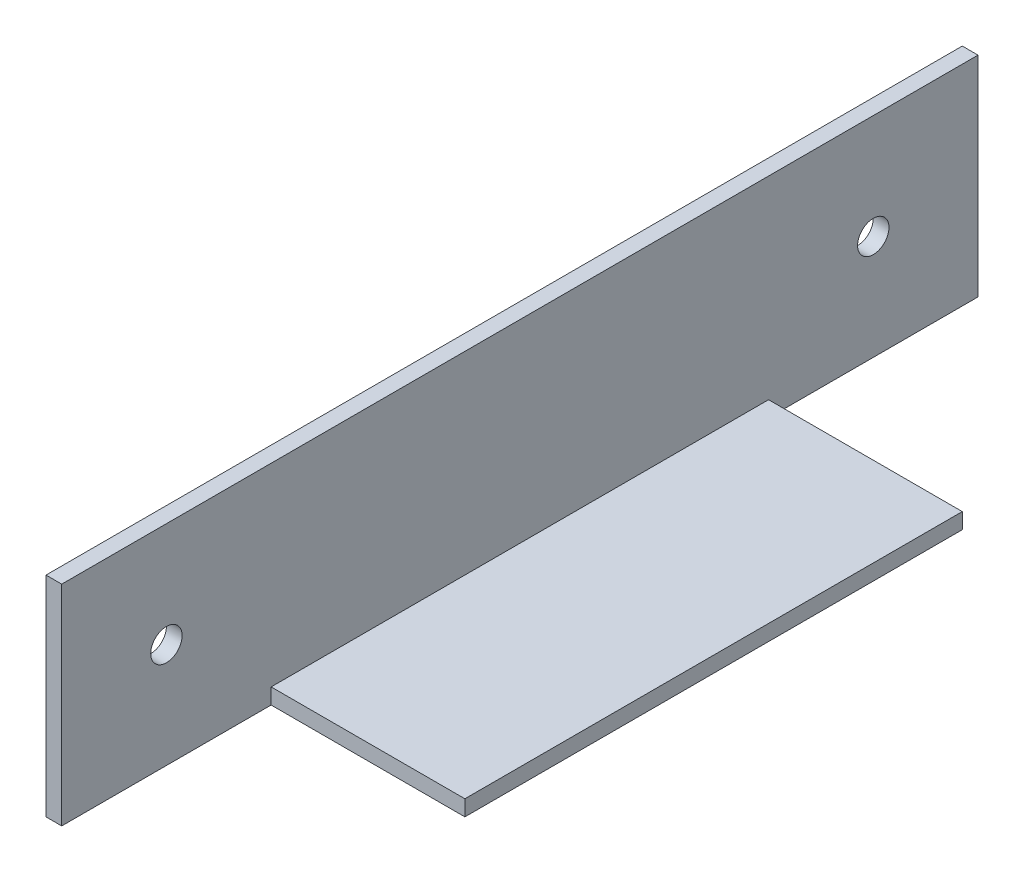
ISO-10303-21;
HEADER;
FILE_DESCRIPTION(('STEP AP214'),'2;1');
FILE_NAME('part.step','',(''),(''),'','','');
FILE_SCHEMA(('AUTOMOTIVE_DESIGN { 1 0 10303 214 1 1 1 1 }'));
ENDSEC;
DATA;
#1=APPLICATION_CONTEXT('core data for automotive mechanical design processes');
#2=APPLICATION_PROTOCOL_DEFINITION('international standard','automotive_design',2000,#1);
#3=PRODUCT_CONTEXT('',#1,'mechanical');
#4=PRODUCT('Part','Part','',(#3));
#5=PRODUCT_RELATED_PRODUCT_CATEGORY('part','',(#4));
#6=PRODUCT_DEFINITION_FORMATION('','',#4);
#7=PRODUCT_DEFINITION_CONTEXT('part definition',#1,'design');
#8=PRODUCT_DEFINITION('design','',#6,#7);
#9=PRODUCT_DEFINITION_SHAPE('','',#8);
#10=(LENGTH_UNIT() NAMED_UNIT(*) SI_UNIT(.MILLI.,.METRE.));
#11=(NAMED_UNIT(*) PLANE_ANGLE_UNIT() SI_UNIT($,.RADIAN.));
#12=(NAMED_UNIT(*) SI_UNIT($,.STERADIAN.) SOLID_ANGLE_UNIT());
#13=UNCERTAINTY_MEASURE_WITH_UNIT(LENGTH_MEASURE(1.E-05),#10,'distance_accuracy_value','');
#14=(GEOMETRIC_REPRESENTATION_CONTEXT(3) GLOBAL_UNCERTAINTY_ASSIGNED_CONTEXT((#13)) GLOBAL_UNIT_ASSIGNED_CONTEXT((#10,
#11,#12)) REPRESENTATION_CONTEXT('',''));
#15=CARTESIAN_POINT('',(0.,0.,0.));
#16=DIRECTION('',(0.,0.,1.));
#17=DIRECTION('',(1.,0.,0.));
#18=AXIS2_PLACEMENT_3D('',#15,#16,#17);
#19=CARTESIAN_POINT('',(0.,20.,87.5));
#20=DIRECTION('',(1.,0.,0.));
#21=DIRECTION('',(0.,1.,0.));
#22=AXIS2_PLACEMENT_3D('',#19,#20,#21);
#23=PLANE('',#22);
#24=CARTESIAN_POINT('',(0.,9.99999999999999,10.));
#25=DIRECTION('',(-1.,0.,0.));
#26=DIRECTION('',(0.,-1.,0.));
#27=AXIS2_PLACEMENT_3D('',#24,#25,#26);
#28=CIRCLE('',#27,1.5);
#29=CARTESIAN_POINT('',(0.,8.5,10.));
#30=VERTEX_POINT('',#29);
#31=EDGE_CURVE('E150',#30,#30,#28,.T.);
#32=ORIENTED_EDGE('',*,*,#31,.F.);
#33=EDGE_LOOP('',(#32));
#34=FACE_BOUND('',#33,.T.);
#35=CARTESIAN_POINT('',(0.,10.,77.5));
#36=DIRECTION('',(-1.,0.,0.));
#37=DIRECTION('',(0.,-1.,0.));
#38=AXIS2_PLACEMENT_3D('',#35,#36,#37);
#39=CIRCLE('',#38,1.50000000000003);
#40=CARTESIAN_POINT('',(0.,8.49999999999998,77.5));
#41=VERTEX_POINT('',#40);
#42=EDGE_CURVE('E139',#41,#41,#39,.T.);
#43=ORIENTED_EDGE('',*,*,#42,.F.);
#44=EDGE_LOOP('',(#43));
#45=FACE_BOUND('',#44,.T.);
#46=DIRECTION('',(0.,-1.,0.));
#47=VECTOR('',#46,1.);
#48=CARTESIAN_POINT('',(0.,20.,0.));
#49=LINE('',#48,#47);
#50=CARTESIAN_POINT('',(0.,20.,0.));
#51=VERTEX_POINT('',#50);
#52=CARTESIAN_POINT('',(0.,0.,0.));
#53=VERTEX_POINT('',#52);
#54=EDGE_CURVE('E138',#51,#53,#49,.T.);
#55=ORIENTED_EDGE('',*,*,#54,.T.);
#56=DIRECTION('',(0.,0.,-1.));
#57=VECTOR('',#56,1.);
#58=CARTESIAN_POINT('',(0.,0.,87.5));
#59=LINE('',#58,#57);
#60=CARTESIAN_POINT('',(0.,0.,87.5));
#61=VERTEX_POINT('',#60);
#62=EDGE_CURVE('E11',#61,#53,#59,.T.);
#63=ORIENTED_EDGE('',*,*,#62,.F.);
#64=DIRECTION('',(0.,-1.,0.));
#65=VECTOR('',#64,1.);
#66=CARTESIAN_POINT('',(0.,20.,87.5));
#67=LINE('',#66,#65);
#68=CARTESIAN_POINT('',(0.,20.,87.5));
#69=VERTEX_POINT('',#68);
#70=EDGE_CURVE('E154',#69,#61,#67,.T.);
#71=ORIENTED_EDGE('',*,*,#70,.F.);
#72=DIRECTION('',(0.,0.,-1.));
#73=VECTOR('',#72,1.);
#74=CARTESIAN_POINT('',(0.,20.,87.5));
#75=LINE('',#74,#73);
#76=EDGE_CURVE('E132',#69,#51,#75,.T.);
#77=ORIENTED_EDGE('',*,*,#76,.T.);
#78=EDGE_LOOP('',(#55,#63,#71,#77));
#79=FACE_BOUND('',#78,.T.);
#80=ADVANCED_FACE('F31',(#34,#45,#79),#23,.F.);
#81=CARTESIAN_POINT('',(0.,0.,87.5));
#82=DIRECTION('',(0.,1.,0.));
#83=DIRECTION('',(0.,0.,1.));
#84=AXIS2_PLACEMENT_3D('',#81,#82,#83);
#85=PLANE('',#84);
#86=DIRECTION('',(0.,0.,-1.));
#87=VECTOR('',#86,1.);
#88=CARTESIAN_POINT('',(20.,0.,87.5));
#89=LINE('',#88,#87);
#90=CARTESIAN_POINT('',(20.,0.,67.5));
#91=VERTEX_POINT('',#90);
#92=CARTESIAN_POINT('',(20.,0.,20.));
#93=VERTEX_POINT('',#92);
#94=EDGE_CURVE('E39',#91,#93,#89,.T.);
#95=ORIENTED_EDGE('',*,*,#94,.F.);
#96=DIRECTION('',(1.,0.,0.));
#97=VECTOR('',#96,1.);
#98=CARTESIAN_POINT('',(20.,0.,67.5));
#99=LINE('',#98,#97);
#100=CARTESIAN_POINT('',(1.5,0.,67.5));
#101=VERTEX_POINT('',#100);
#102=EDGE_CURVE('E122',#101,#91,#99,.T.);
#103=ORIENTED_EDGE('',*,*,#102,.F.);
#104=DIRECTION('',(0.,0.,-1.));
#105=VECTOR('',#104,1.);
#106=CARTESIAN_POINT('',(1.5,0.,87.5));
#107=LINE('',#106,#105);
#108=CARTESIAN_POINT('',(1.5,0.,87.5));
#109=VERTEX_POINT('',#108);
#110=EDGE_CURVE('E111',#109,#101,#107,.T.);
#111=ORIENTED_EDGE('',*,*,#110,.F.);
#112=DIRECTION('',(1.,0.,0.));
#113=VECTOR('',#112,1.);
#114=CARTESIAN_POINT('',(0.,0.,87.5));
#115=LINE('',#114,#113);
#116=EDGE_CURVE('E76',#61,#109,#115,.T.);
#117=ORIENTED_EDGE('',*,*,#116,.F.);
#118=ORIENTED_EDGE('',*,*,#62,.T.);
#119=DIRECTION('',(1.,0.,0.));
#120=VECTOR('',#119,1.);
#121=CARTESIAN_POINT('',(0.,0.,0.));
#122=LINE('',#121,#120);
#123=CARTESIAN_POINT('',(1.5,0.,0.));
#124=VERTEX_POINT('',#123);
#125=EDGE_CURVE('E143',#53,#124,#122,.T.);
#126=ORIENTED_EDGE('',*,*,#125,.T.);
#127=DIRECTION('',(0.,0.,-1.));
#128=VECTOR('',#127,1.);
#129=CARTESIAN_POINT('',(1.5,0.,0.));
#130=LINE('',#129,#128);
#131=CARTESIAN_POINT('',(1.5,0.,20.));
#132=VERTEX_POINT('',#131);
#133=EDGE_CURVE('E289',#132,#124,#130,.T.);
#134=ORIENTED_EDGE('',*,*,#133,.F.);
#135=DIRECTION('',(-1.,0.,0.));
#136=VECTOR('',#135,1.);
#137=CARTESIAN_POINT('',(20.,0.,20.));
#138=LINE('',#137,#136);
#139=EDGE_CURVE('E285',#93,#132,#138,.T.);
#140=ORIENTED_EDGE('',*,*,#139,.F.);
#141=EDGE_LOOP('',(#95,#103,#111,#117,#118,#126,#134,#140));
#142=FACE_BOUND('',#141,.T.);
#143=ADVANCED_FACE('F170',(#142),#85,.F.);
#144=CARTESIAN_POINT('',(20.,0.,87.5));
#145=DIRECTION('',(-1.,0.,0.));
#146=DIRECTION('',(0.,0.,1.));
#147=AXIS2_PLACEMENT_3D('',#144,#145,#146);
#148=PLANE('',#147);
#149=DIRECTION('',(0.,0.,-1.));
#150=VECTOR('',#149,1.);
#151=CARTESIAN_POINT('',(20.,1.5,87.5));
#152=LINE('',#151,#150);
#153=CARTESIAN_POINT('',(20.,1.5,67.5));
#154=VERTEX_POINT('',#153);
#155=CARTESIAN_POINT('',(20.,1.5,20.));
#156=VERTEX_POINT('',#155);
#157=EDGE_CURVE('E128',#154,#156,#152,.T.);
#158=ORIENTED_EDGE('',*,*,#157,.F.);
#159=DIRECTION('',(0.,-1.,0.));
#160=VECTOR('',#159,1.);
#161=CARTESIAN_POINT('',(20.,1.5,67.5));
#162=LINE('',#161,#160);
#163=EDGE_CURVE('E114',#154,#91,#162,.T.);
#164=ORIENTED_EDGE('',*,*,#163,.T.);
#165=ORIENTED_EDGE('',*,*,#94,.T.);
#166=DIRECTION('',(0.,-1.,0.));
#167=VECTOR('',#166,1.);
#168=CARTESIAN_POINT('',(20.,1.5,20.));
#169=LINE('',#168,#167);
#170=EDGE_CURVE('E288',#156,#93,#169,.T.);
#171=ORIENTED_EDGE('',*,*,#170,.F.);
#172=EDGE_LOOP('',(#158,#164,#165,#171));
#173=FACE_BOUND('',#172,.T.);
#174=ADVANCED_FACE('F173',(#173),#148,.F.);
#175=CARTESIAN_POINT('',(20.,1.5,87.5));
#176=DIRECTION('',(0.,-1.,0.));
#177=DIRECTION('',(1.,0.,0.));
#178=AXIS2_PLACEMENT_3D('',#175,#176,#177);
#179=PLANE('',#178);
#180=DIRECTION('',(0.,0.,-1.));
#181=VECTOR('',#180,1.);
#182=CARTESIAN_POINT('',(1.5,1.5,87.5));
#183=LINE('',#182,#181);
#184=CARTESIAN_POINT('',(1.5,1.5,67.5));
#185=VERTEX_POINT('',#184);
#186=CARTESIAN_POINT('',(1.5,1.5,20.));
#187=VERTEX_POINT('',#186);
#188=EDGE_CURVE('E109',#185,#187,#183,.T.);
#189=ORIENTED_EDGE('',*,*,#188,.F.);
#190=DIRECTION('',(1.,0.,0.));
#191=VECTOR('',#190,1.);
#192=CARTESIAN_POINT('',(20.,1.5,67.5));
#193=LINE('',#192,#191);
#194=EDGE_CURVE('E115',#185,#154,#193,.T.);
#195=ORIENTED_EDGE('',*,*,#194,.T.);
#196=ORIENTED_EDGE('',*,*,#157,.T.);
#197=DIRECTION('',(-1.,0.,0.));
#198=VECTOR('',#197,1.);
#199=CARTESIAN_POINT('',(20.,1.5,20.));
#200=LINE('',#199,#198);
#201=EDGE_CURVE('E127',#156,#187,#200,.T.);
#202=ORIENTED_EDGE('',*,*,#201,.T.);
#203=EDGE_LOOP('',(#189,#195,#196,#202));
#204=FACE_BOUND('',#203,.T.);
#205=ADVANCED_FACE('F125',(#204),#179,.F.);
#206=CARTESIAN_POINT('',(1.5,1.5,87.5));
#207=DIRECTION('',(-1.,0.,0.));
#208=DIRECTION('',(0.,-1.,0.));
#209=AXIS2_PLACEMENT_3D('',#206,#207,#208);
#210=PLANE('',#209);
#211=CARTESIAN_POINT('',(1.5,9.99999999999999,10.));
#212=DIRECTION('',(-1.,0.,0.));
#213=DIRECTION('',(0.,-1.,0.));
#214=AXIS2_PLACEMENT_3D('',#211,#212,#213);
#215=CIRCLE('',#214,1.5);
#216=CARTESIAN_POINT('',(1.5,8.5,10.));
#217=VERTEX_POINT('',#216);
#218=EDGE_CURVE('E34',#217,#217,#215,.T.);
#219=ORIENTED_EDGE('',*,*,#218,.T.);
#220=EDGE_LOOP('',(#219));
#221=FACE_BOUND('',#220,.T.);
#222=CARTESIAN_POINT('',(1.5,10.,77.5));
#223=DIRECTION('',(-1.,0.,0.));
#224=DIRECTION('',(0.,-1.,0.));
#225=AXIS2_PLACEMENT_3D('',#222,#223,#224);
#226=CIRCLE('',#225,1.50000000000003);
#227=CARTESIAN_POINT('',(1.5,8.49999999999998,77.5));
#228=VERTEX_POINT('',#227);
#229=EDGE_CURVE('E136',#228,#228,#226,.T.);
#230=ORIENTED_EDGE('',*,*,#229,.T.);
#231=EDGE_LOOP('',(#230));
#232=FACE_BOUND('',#231,.T.);
#233=DIRECTION('',(0.,1.,0.));
#234=VECTOR('',#233,1.);
#235=CARTESIAN_POINT('',(1.5,1.5,0.));
#236=LINE('',#235,#234);
#237=CARTESIAN_POINT('',(1.5,20.,0.));
#238=VERTEX_POINT('',#237);
#239=EDGE_CURVE('E47',#124,#238,#236,.T.);
#240=ORIENTED_EDGE('',*,*,#239,.T.);
#241=DIRECTION('',(0.,0.,-1.));
#242=VECTOR('',#241,1.);
#243=CARTESIAN_POINT('',(1.5,20.,87.5));
#244=LINE('',#243,#242);
#245=CARTESIAN_POINT('',(1.5,20.,87.5));
#246=VERTEX_POINT('',#245);
#247=EDGE_CURVE('E129',#246,#238,#244,.T.);
#248=ORIENTED_EDGE('',*,*,#247,.F.);
#249=DIRECTION('',(0.,1.,0.));
#250=VECTOR('',#249,1.);
#251=CARTESIAN_POINT('',(1.5,1.5,87.5));
#252=LINE('',#251,#250);
#253=EDGE_CURVE('E157',#109,#246,#252,.T.);
#254=ORIENTED_EDGE('',*,*,#253,.F.);
#255=ORIENTED_EDGE('',*,*,#110,.T.);
#256=DIRECTION('',(0.,-1.,0.));
#257=VECTOR('',#256,1.);
#258=CARTESIAN_POINT('',(1.5,1.5,67.5));
#259=LINE('',#258,#257);
#260=EDGE_CURVE('E105',#185,#101,#259,.T.);
#261=ORIENTED_EDGE('',*,*,#260,.F.);
#262=ORIENTED_EDGE('',*,*,#188,.T.);
#263=DIRECTION('',(0.,-1.,0.));
#264=VECTOR('',#263,1.);
#265=CARTESIAN_POINT('',(1.5,1.5,20.));
#266=LINE('',#265,#264);
#267=EDGE_CURVE('E286',#187,#132,#266,.T.);
#268=ORIENTED_EDGE('',*,*,#267,.T.);
#269=ORIENTED_EDGE('',*,*,#133,.T.);
#270=EDGE_LOOP('',(#240,#248,#254,#255,#261,#262,#268,#269));
#271=FACE_BOUND('',#270,.T.);
#272=ADVANCED_FACE('F107',(#221,#232,#271),#210,.F.);
#273=CARTESIAN_POINT('',(1.5,20.,87.5));
#274=DIRECTION('',(0.,-1.,0.));
#275=DIRECTION('',(0.,0.,-1.));
#276=AXIS2_PLACEMENT_3D('',#273,#274,#275);
#277=PLANE('',#276);
#278=DIRECTION('',(-1.,0.,0.));
#279=VECTOR('',#278,1.);
#280=CARTESIAN_POINT('',(1.5,20.,0.));
#281=LINE('',#280,#279);
#282=EDGE_CURVE('E70',#238,#51,#281,.T.);
#283=ORIENTED_EDGE('',*,*,#282,.T.);
#284=ORIENTED_EDGE('',*,*,#76,.F.);
#285=DIRECTION('',(-1.,0.,0.));
#286=VECTOR('',#285,1.);
#287=CARTESIAN_POINT('',(1.5,20.,87.5));
#288=LINE('',#287,#286);
#289=EDGE_CURVE('E56',#246,#69,#288,.T.);
#290=ORIENTED_EDGE('',*,*,#289,.F.);
#291=ORIENTED_EDGE('',*,*,#247,.T.);
#292=EDGE_LOOP('',(#283,#284,#290,#291));
#293=FACE_BOUND('',#292,.T.);
#294=ADVANCED_FACE('F186',(#293),#277,.F.);
#295=CARTESIAN_POINT('',(0.,0.,87.5));
#296=DIRECTION('',(0.,0.,1.));
#297=DIRECTION('',(1.,0.,0.));
#298=AXIS2_PLACEMENT_3D('',#295,#296,#297);
#299=PLANE('',#298);
#300=ORIENTED_EDGE('',*,*,#116,.T.);
#301=ORIENTED_EDGE('',*,*,#253,.T.);
#302=ORIENTED_EDGE('',*,*,#289,.T.);
#303=ORIENTED_EDGE('',*,*,#70,.T.);
#304=EDGE_LOOP('',(#300,#301,#302,#303));
#305=FACE_BOUND('',#304,.T.);
#306=ADVANCED_FACE('F190',(#305),#299,.T.);
#307=CARTESIAN_POINT('',(0.,0.,0.));
#308=DIRECTION('',(0.,0.,1.));
#309=DIRECTION('',(1.,0.,0.));
#310=AXIS2_PLACEMENT_3D('',#307,#308,#309);
#311=PLANE('',#310);
#312=ORIENTED_EDGE('',*,*,#239,.F.);
#313=ORIENTED_EDGE('',*,*,#125,.F.);
#314=ORIENTED_EDGE('',*,*,#54,.F.);
#315=ORIENTED_EDGE('',*,*,#282,.F.);
#316=EDGE_LOOP('',(#312,#313,#314,#315));
#317=FACE_BOUND('',#316,.T.);
#318=ADVANCED_FACE('F167',(#317),#311,.F.);
#319=CARTESIAN_POINT('',(10.,10.,77.5));
#320=DIRECTION('',(-1.,0.,0.));
#321=DIRECTION('',(0.,-1.,0.));
#322=AXIS2_PLACEMENT_3D('',#319,#320,#321);
#323=CYLINDRICAL_SURFACE('',#322,1.50000000000003);
#324=ORIENTED_EDGE('',*,*,#42,.T.);
#325=EDGE_LOOP('',(#324));
#326=FACE_BOUND('',#325,.T.);
#327=ORIENTED_EDGE('',*,*,#229,.F.);
#328=EDGE_LOOP('',(#327));
#329=FACE_BOUND('',#328,.T.);
#330=ADVANCED_FACE('F193',(#326,#329),#323,.F.);
#331=CARTESIAN_POINT('',(10.,9.99999999999999,10.));
#332=DIRECTION('',(-1.,0.,0.));
#333=DIRECTION('',(0.,-1.,0.));
#334=AXIS2_PLACEMENT_3D('',#331,#332,#333);
#335=CYLINDRICAL_SURFACE('',#334,1.5);
#336=ORIENTED_EDGE('',*,*,#31,.T.);
#337=EDGE_LOOP('',(#336));
#338=FACE_BOUND('',#337,.T.);
#339=ORIENTED_EDGE('',*,*,#218,.F.);
#340=EDGE_LOOP('',(#339));
#341=FACE_BOUND('',#340,.T.);
#342=ADVANCED_FACE('F198',(#338,#341),#335,.F.);
#343=CARTESIAN_POINT('',(20.,1.5,20.));
#344=DIRECTION('',(0.,0.,1.));
#345=DIRECTION('',(1.,0.,0.));
#346=AXIS2_PLACEMENT_3D('',#343,#344,#345);
#347=PLANE('',#346);
#348=ORIENTED_EDGE('',*,*,#139,.T.);
#349=ORIENTED_EDGE('',*,*,#267,.F.);
#350=ORIENTED_EDGE('',*,*,#201,.F.);
#351=ORIENTED_EDGE('',*,*,#170,.T.);
#352=EDGE_LOOP('',(#348,#349,#350,#351));
#353=FACE_BOUND('',#352,.T.);
#354=ADVANCED_FACE('F201',(#353),#347,.F.);
#355=CARTESIAN_POINT('',(20.,1.5,67.5));
#356=DIRECTION('',(0.,0.,-1.));
#357=DIRECTION('',(-1.,0.,0.));
#358=AXIS2_PLACEMENT_3D('',#355,#356,#357);
#359=PLANE('',#358);
#360=ORIENTED_EDGE('',*,*,#102,.T.);
#361=ORIENTED_EDGE('',*,*,#163,.F.);
#362=ORIENTED_EDGE('',*,*,#194,.F.);
#363=ORIENTED_EDGE('',*,*,#260,.T.);
#364=EDGE_LOOP('',(#360,#361,#362,#363));
#365=FACE_BOUND('',#364,.T.);
#366=ADVANCED_FACE('F118',(#365),#359,.F.);
#367=CLOSED_SHELL('',(#80,#143,#174,#205,#272,#294,#306,#318,#330,#342,#354,#366));
#368=MANIFOLD_SOLID_BREP('B2',#367);
#369=ADVANCED_BREP_SHAPE_REPRESENTATION('',(#18,#368),#14);
#370=SHAPE_DEFINITION_REPRESENTATION(#9,#369);
ENDSEC;
END-ISO-10303-21;
